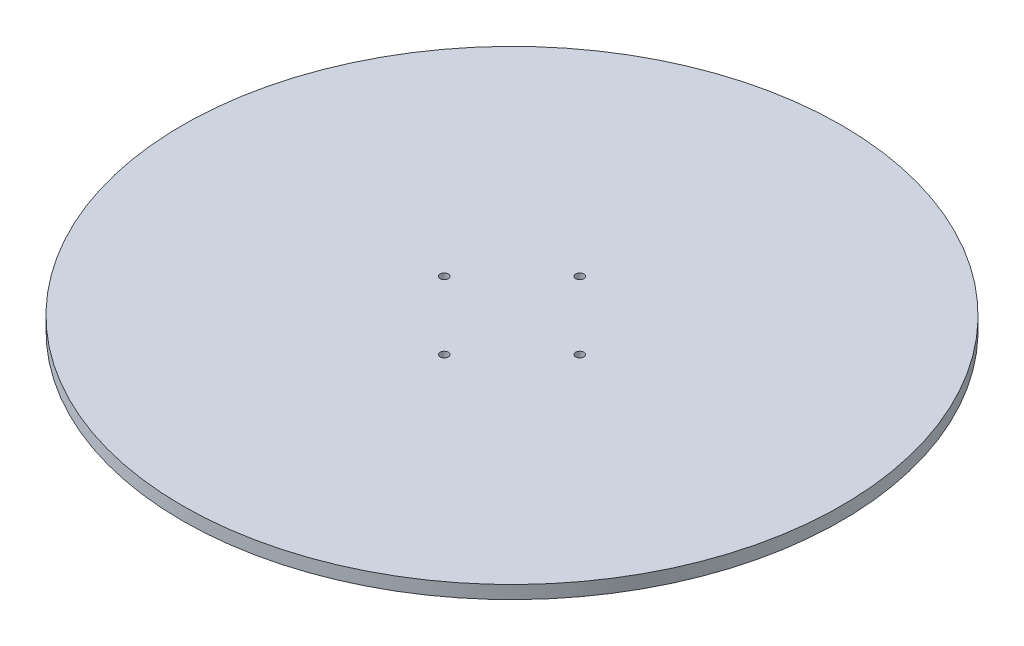
ISO-10303-21;
HEADER;
FILE_DESCRIPTION(('STEP AP214'),'2;1');
FILE_NAME('part.step','',(''),(''),'','','');
FILE_SCHEMA(('AUTOMOTIVE_DESIGN { 1 0 10303 214 1 1 1 1 }'));
ENDSEC;
DATA;
#1=APPLICATION_CONTEXT('core data for automotive mechanical design processes');
#2=APPLICATION_PROTOCOL_DEFINITION('international standard','automotive_design',2000,#1);
#3=PRODUCT_CONTEXT('',#1,'mechanical');
#4=PRODUCT('Part','Part','',(#3));
#5=PRODUCT_RELATED_PRODUCT_CATEGORY('part','',(#4));
#6=PRODUCT_DEFINITION_FORMATION('','',#4);
#7=PRODUCT_DEFINITION_CONTEXT('part definition',#1,'design');
#8=PRODUCT_DEFINITION('design','',#6,#7);
#9=PRODUCT_DEFINITION_SHAPE('','',#8);
#10=(LENGTH_UNIT() NAMED_UNIT(*) SI_UNIT(.MILLI.,.METRE.));
#11=(NAMED_UNIT(*) PLANE_ANGLE_UNIT() SI_UNIT($,.RADIAN.));
#12=(NAMED_UNIT(*) SI_UNIT($,.STERADIAN.) SOLID_ANGLE_UNIT());
#13=UNCERTAINTY_MEASURE_WITH_UNIT(LENGTH_MEASURE(1.E-05),#10,'distance_accuracy_value','');
#14=(GEOMETRIC_REPRESENTATION_CONTEXT(3) GLOBAL_UNCERTAINTY_ASSIGNED_CONTEXT((#13)) GLOBAL_UNIT_ASSIGNED_CONTEXT((#10,
#11,#12)) REPRESENTATION_CONTEXT('',''));
#15=CARTESIAN_POINT('',(0.,0.,0.));
#16=DIRECTION('',(0.,0.,1.));
#17=DIRECTION('',(1.,0.,0.));
#18=AXIS2_PLACEMENT_3D('',#15,#16,#17);
#19=CARTESIAN_POINT('',(1.66533453693773E-13,1.5875,0.));
#20=DIRECTION('',(0.,-1.,0.));
#21=DIRECTION('',(0.,0.,-1.));
#22=AXIS2_PLACEMENT_3D('',#19,#20,#21);
#23=CYLINDRICAL_SURFACE('',#22,80.);
#24=CARTESIAN_POINT('',(1.66533453693773E-13,1.5875,0.));
#25=DIRECTION('',(0.,1.,0.));
#26=DIRECTION('',(0.,0.,1.));
#27=AXIS2_PLACEMENT_3D('',#24,#25,#26);
#28=CIRCLE('',#27,80.);
#29=CARTESIAN_POINT('',(1.66533453693773E-13,1.5875,80.));
#30=VERTEX_POINT('',#29);
#31=EDGE_CURVE('E10',#30,#30,#28,.T.);
#32=ORIENTED_EDGE('',*,*,#31,.F.);
#33=EDGE_LOOP('',(#32));
#34=FACE_BOUND('',#33,.T.);
#35=CARTESIAN_POINT('',(1.66533453693773E-13,-1.5875,0.));
#36=DIRECTION('',(0.,1.,0.));
#37=DIRECTION('',(0.,0.,1.));
#38=AXIS2_PLACEMENT_3D('',#35,#36,#37);
#39=CIRCLE('',#38,80.);
#40=CARTESIAN_POINT('',(1.66533453693773E-13,-1.5875,80.));
#41=VERTEX_POINT('',#40);
#42=EDGE_CURVE('E34',#41,#41,#39,.T.);
#43=ORIENTED_EDGE('',*,*,#42,.T.);
#44=EDGE_LOOP('',(#43));
#45=FACE_BOUND('',#44,.T.);
#46=ADVANCED_FACE('F31',(#34,#45),#23,.T.);
#47=CARTESIAN_POINT('',(1.66533453693773E-13,1.5875,0.));
#48=DIRECTION('',(0.,1.,0.));
#49=DIRECTION('',(0.,0.,1.));
#50=AXIS2_PLACEMENT_3D('',#47,#48,#49);
#51=PLANE('',#50);
#52=CARTESIAN_POINT('',(16.45,1.5875,-1.90845267228431E-13));
#53=DIRECTION('',(0.,-1.,0.));
#54=DIRECTION('',(0.,0.,-1.));
#55=AXIS2_PLACEMENT_3D('',#52,#53,#54);
#56=CIRCLE('',#55,1.00000000000001);
#57=CARTESIAN_POINT('',(16.45,1.5875,-1.0000000000002));
#58=VERTEX_POINT('',#57);
#59=EDGE_CURVE('E41',#58,#58,#56,.T.);
#60=ORIENTED_EDGE('',*,*,#59,.T.);
#61=EDGE_LOOP('',(#60));
#62=FACE_BOUND('',#61,.T.);
#63=CARTESIAN_POINT('',(0.,1.5875,-16.45));
#64=DIRECTION('',(0.,-1.,0.));
#65=DIRECTION('',(0.,0.,-1.));
#66=AXIS2_PLACEMENT_3D('',#63,#64,#65);
#67=CIRCLE('',#66,1.);
#68=CARTESIAN_POINT('',(0.,1.5875,-17.45));
#69=VERTEX_POINT('',#68);
#70=EDGE_CURVE('E58',#69,#69,#67,.T.);
#71=ORIENTED_EDGE('',*,*,#70,.T.);
#72=EDGE_LOOP('',(#71));
#73=FACE_BOUND('',#72,.T.);
#74=CARTESIAN_POINT('',(-16.45,1.5875,0.));
#75=DIRECTION('',(0.,-1.,0.));
#76=DIRECTION('',(0.,0.,-1.));
#77=AXIS2_PLACEMENT_3D('',#74,#75,#76);
#78=CIRCLE('',#77,0.999999999999993);
#79=CARTESIAN_POINT('',(-16.45,1.5875,-0.999999999999914));
#80=VERTEX_POINT('',#79);
#81=EDGE_CURVE('E52',#80,#80,#78,.T.);
#82=ORIENTED_EDGE('',*,*,#81,.T.);
#83=EDGE_LOOP('',(#82));
#84=FACE_BOUND('',#83,.T.);
#85=CARTESIAN_POINT('',(0.,1.5875,16.45));
#86=DIRECTION('',(0.,-1.,0.));
#87=DIRECTION('',(0.,0.,-1.));
#88=AXIS2_PLACEMENT_3D('',#85,#86,#87);
#89=CIRCLE('',#88,0.999999999999993);
#90=CARTESIAN_POINT('',(0.,1.5875,15.45));
#91=VERTEX_POINT('',#90);
#92=EDGE_CURVE('E46',#91,#91,#89,.T.);
#93=ORIENTED_EDGE('',*,*,#92,.T.);
#94=EDGE_LOOP('',(#93));
#95=FACE_BOUND('',#94,.T.);
#96=ORIENTED_EDGE('',*,*,#31,.T.);
#97=EDGE_LOOP('',(#96));
#98=FACE_BOUND('',#97,.T.);
#99=ADVANCED_FACE('F67',(#62,#73,#84,#95,#98),#51,.T.);
#100=CARTESIAN_POINT('',(1.66533453693773E-13,-1.5875,0.));
#101=DIRECTION('',(0.,1.,0.));
#102=DIRECTION('',(0.,0.,1.));
#103=AXIS2_PLACEMENT_3D('',#100,#101,#102);
#104=PLANE('',#103);
#105=CARTESIAN_POINT('',(16.45,-1.5875,-1.90845267228431E-13));
#106=DIRECTION('',(0.,-1.,0.));
#107=DIRECTION('',(0.,0.,-1.));
#108=AXIS2_PLACEMENT_3D('',#105,#106,#107);
#109=CIRCLE('',#108,1.00000000000001);
#110=CARTESIAN_POINT('',(16.45,-1.5875,-1.0000000000002));
#111=VERTEX_POINT('',#110);
#112=EDGE_CURVE('E61',#111,#111,#109,.T.);
#113=ORIENTED_EDGE('',*,*,#112,.F.);
#114=EDGE_LOOP('',(#113));
#115=FACE_BOUND('',#114,.T.);
#116=CARTESIAN_POINT('',(0.,-1.5875,-16.45));
#117=DIRECTION('',(0.,-1.,0.));
#118=DIRECTION('',(0.,0.,-1.));
#119=AXIS2_PLACEMENT_3D('',#116,#117,#118);
#120=CIRCLE('',#119,1.);
#121=CARTESIAN_POINT('',(0.,-1.5875,-17.45));
#122=VERTEX_POINT('',#121);
#123=EDGE_CURVE('E55',#122,#122,#120,.T.);
#124=ORIENTED_EDGE('',*,*,#123,.F.);
#125=EDGE_LOOP('',(#124));
#126=FACE_BOUND('',#125,.T.);
#127=CARTESIAN_POINT('',(-16.45,-1.5875,0.));
#128=DIRECTION('',(0.,-1.,0.));
#129=DIRECTION('',(0.,0.,-1.));
#130=AXIS2_PLACEMENT_3D('',#127,#128,#129);
#131=CIRCLE('',#130,0.999999999999993);
#132=CARTESIAN_POINT('',(-16.45,-1.5875,-0.999999999999914));
#133=VERTEX_POINT('',#132);
#134=EDGE_CURVE('E49',#133,#133,#131,.T.);
#135=ORIENTED_EDGE('',*,*,#134,.F.);
#136=EDGE_LOOP('',(#135));
#137=FACE_BOUND('',#136,.T.);
#138=CARTESIAN_POINT('',(0.,-1.5875,16.45));
#139=DIRECTION('',(0.,-1.,0.));
#140=DIRECTION('',(0.,0.,-1.));
#141=AXIS2_PLACEMENT_3D('',#138,#139,#140);
#142=CIRCLE('',#141,0.999999999999993);
#143=CARTESIAN_POINT('',(0.,-1.5875,15.45));
#144=VERTEX_POINT('',#143);
#145=EDGE_CURVE('E43',#144,#144,#142,.T.);
#146=ORIENTED_EDGE('',*,*,#145,.F.);
#147=EDGE_LOOP('',(#146));
#148=FACE_BOUND('',#147,.T.);
#149=ORIENTED_EDGE('',*,*,#42,.F.);
#150=EDGE_LOOP('',(#149));
#151=FACE_BOUND('',#150,.T.);
#152=ADVANCED_FACE('F77',(#115,#126,#137,#148,#151),#104,.F.);
#153=CARTESIAN_POINT('',(0.,1.5875,16.45));
#154=DIRECTION('',(0.,-1.,0.));
#155=DIRECTION('',(0.,0.,-1.));
#156=AXIS2_PLACEMENT_3D('',#153,#154,#155);
#157=CYLINDRICAL_SURFACE('',#156,0.999999999999993);
#158=ORIENTED_EDGE('',*,*,#92,.F.);
#159=EDGE_LOOP('',(#158));
#160=FACE_BOUND('',#159,.T.);
#161=ORIENTED_EDGE('',*,*,#145,.T.);
#162=EDGE_LOOP('',(#161));
#163=FACE_BOUND('',#162,.T.);
#164=ADVANCED_FACE('F80',(#160,#163),#157,.F.);
#165=CARTESIAN_POINT('',(-16.45,1.5875,0.));
#166=DIRECTION('',(0.,-1.,0.));
#167=DIRECTION('',(0.,0.,-1.));
#168=AXIS2_PLACEMENT_3D('',#165,#166,#167);
#169=CYLINDRICAL_SURFACE('',#168,0.999999999999993);
#170=ORIENTED_EDGE('',*,*,#81,.F.);
#171=EDGE_LOOP('',(#170));
#172=FACE_BOUND('',#171,.T.);
#173=ORIENTED_EDGE('',*,*,#134,.T.);
#174=EDGE_LOOP('',(#173));
#175=FACE_BOUND('',#174,.T.);
#176=ADVANCED_FACE('F100',(#172,#175),#169,.F.);
#177=CARTESIAN_POINT('',(0.,1.5875,-16.45));
#178=DIRECTION('',(0.,-1.,0.));
#179=DIRECTION('',(0.,0.,-1.));
#180=AXIS2_PLACEMENT_3D('',#177,#178,#179);
#181=CYLINDRICAL_SURFACE('',#180,1.);
#182=ORIENTED_EDGE('',*,*,#70,.F.);
#183=EDGE_LOOP('',(#182));
#184=FACE_BOUND('',#183,.T.);
#185=ORIENTED_EDGE('',*,*,#123,.T.);
#186=EDGE_LOOP('',(#185));
#187=FACE_BOUND('',#186,.T.);
#188=ADVANCED_FACE('F73',(#184,#187),#181,.F.);
#189=CARTESIAN_POINT('',(16.45,1.5875,-1.90845267228431E-13));
#190=DIRECTION('',(0.,-1.,0.));
#191=DIRECTION('',(0.,0.,-1.));
#192=AXIS2_PLACEMENT_3D('',#189,#190,#191);
#193=CYLINDRICAL_SURFACE('',#192,1.00000000000001);
#194=ORIENTED_EDGE('',*,*,#59,.F.);
#195=EDGE_LOOP('',(#194));
#196=FACE_BOUND('',#195,.T.);
#197=ORIENTED_EDGE('',*,*,#112,.T.);
#198=EDGE_LOOP('',(#197));
#199=FACE_BOUND('',#198,.T.);
#200=ADVANCED_FACE('F70',(#196,#199),#193,.F.);
#201=CLOSED_SHELL('',(#46,#99,#152,#164,#176,#188,#200));
#202=MANIFOLD_SOLID_BREP('B2',#201);
#203=ADVANCED_BREP_SHAPE_REPRESENTATION('',(#18,#202),#14);
#204=SHAPE_DEFINITION_REPRESENTATION(#9,#203);
ENDSEC;
END-ISO-10303-21;
